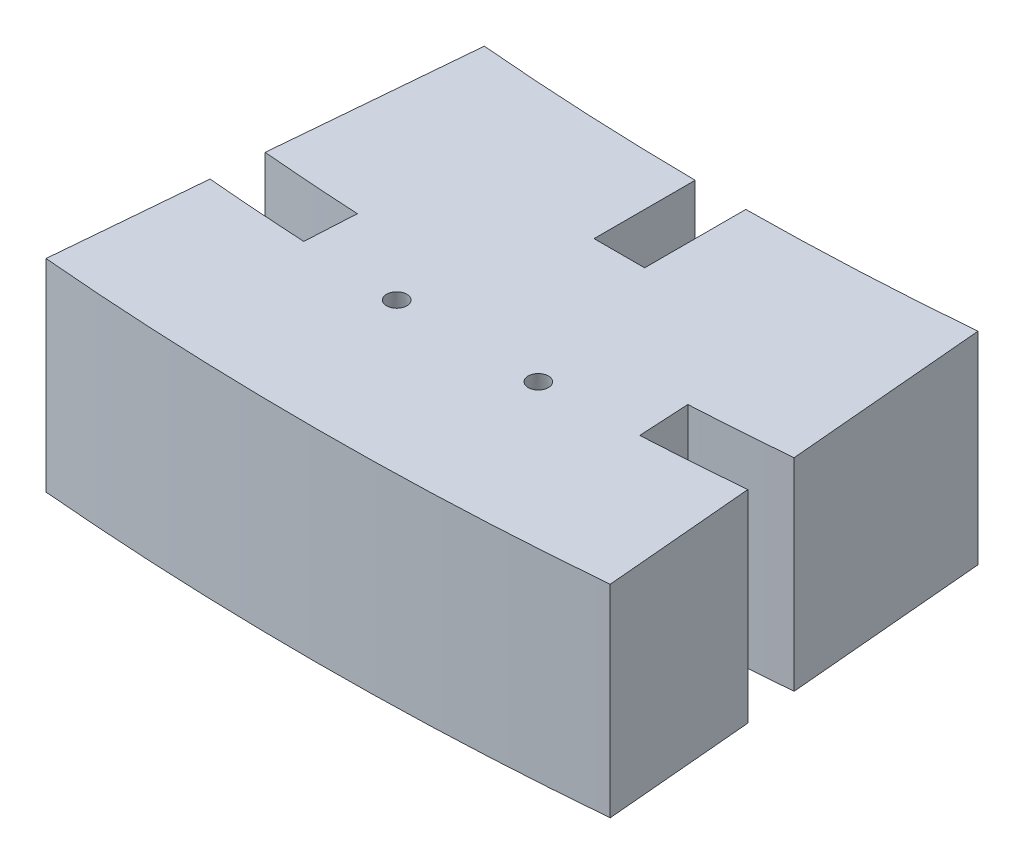
ISO-10303-21;
HEADER;
FILE_DESCRIPTION(('STEP AP214'),'2;1');
FILE_NAME('part.step','',(''),(''),'','','');
FILE_SCHEMA(('AUTOMOTIVE_DESIGN { 1 0 10303 214 1 1 1 1 }'));
ENDSEC;
DATA;
#1=APPLICATION_CONTEXT('core data for automotive mechanical design processes');
#2=APPLICATION_PROTOCOL_DEFINITION('international standard','automotive_design',2000,#1);
#3=PRODUCT_CONTEXT('',#1,'mechanical');
#4=PRODUCT('Part','Part','',(#3));
#5=PRODUCT_RELATED_PRODUCT_CATEGORY('part','',(#4));
#6=PRODUCT_DEFINITION_FORMATION('','',#4);
#7=PRODUCT_DEFINITION_CONTEXT('part definition',#1,'design');
#8=PRODUCT_DEFINITION('design','',#6,#7);
#9=PRODUCT_DEFINITION_SHAPE('','',#8);
#10=(LENGTH_UNIT() NAMED_UNIT(*) SI_UNIT(.MILLI.,.METRE.));
#11=(NAMED_UNIT(*) PLANE_ANGLE_UNIT() SI_UNIT($,.RADIAN.));
#12=(NAMED_UNIT(*) SI_UNIT($,.STERADIAN.) SOLID_ANGLE_UNIT());
#13=UNCERTAINTY_MEASURE_WITH_UNIT(LENGTH_MEASURE(1.E-05),#10,'distance_accuracy_value','');
#14=(GEOMETRIC_REPRESENTATION_CONTEXT(3) GLOBAL_UNCERTAINTY_ASSIGNED_CONTEXT((#13)) GLOBAL_UNIT_ASSIGNED_CONTEXT((#10,
#11,#12)) REPRESENTATION_CONTEXT('',''));
#15=CARTESIAN_POINT('',(0.,0.,0.));
#16=DIRECTION('',(0.,0.,1.));
#17=DIRECTION('',(1.,0.,0.));
#18=AXIS2_PLACEMENT_3D('',#15,#16,#17);
#19=CARTESIAN_POINT('',(-139.449188396242,100.,1593.91151694679));
#20=DIRECTION('',(0.996194698091746,0.,0.0871557427476512));
#21=DIRECTION('',(0.0871557427476512,0.,-0.996194698091746));
#22=AXIS2_PLACEMENT_3D('',#19,#20,#21);
#23=PLANE('',#22);
#24=DIRECTION('',(-0.0871557427476512,0.,0.996194698091746));
#25=VECTOR('',#24,1.);
#26=CARTESIAN_POINT('',(-139.449188396242,100.,1593.91151694679));
#27=LINE('',#26,#25);
#28=CARTESIAN_POINT('',(-132.92596998852,100.,1519.35078936419));
#29=VERTEX_POINT('',#28);
#30=CARTESIAN_POINT('',(-139.449188396242,100.,1593.91151694679));
#31=VERTEX_POINT('',#30);
#32=EDGE_CURVE('E257',#29,#31,#27,.T.);
#33=ORIENTED_EDGE('',*,*,#32,.F.);
#34=DIRECTION('',(0.,1.,0.));
#35=VECTOR('',#34,1.);
#36=CARTESIAN_POINT('',(-132.92596998852,0.,1519.35078936419));
#37=LINE('',#36,#35);
#38=CARTESIAN_POINT('',(-132.92596998852,0.,1519.35078936419));
#39=VERTEX_POINT('',#38);
#40=EDGE_CURVE('E178',#39,#29,#37,.T.);
#41=ORIENTED_EDGE('',*,*,#40,.F.);
#42=DIRECTION('',(-0.0871557427476512,0.,0.996194698091746));
#43=VECTOR('',#42,1.);
#44=CARTESIAN_POINT('',(-139.449188396242,0.,1593.91151694679));
#45=LINE('',#44,#43);
#46=CARTESIAN_POINT('',(-139.449188396242,0.,1593.91151694679));
#47=VERTEX_POINT('',#46);
#48=EDGE_CURVE('E272',#39,#47,#45,.T.);
#49=ORIENTED_EDGE('',*,*,#48,.T.);
#50=DIRECTION('',(0.,-1.,0.));
#51=VECTOR('',#50,1.);
#52=CARTESIAN_POINT('',(-139.449188396242,100.,1593.91151694679));
#53=LINE('',#52,#51);
#54=EDGE_CURVE('E44',#31,#47,#53,.T.);
#55=ORIENTED_EDGE('',*,*,#54,.F.);
#56=EDGE_LOOP('',(#33,#41,#49,#55));
#57=FACE_BOUND('',#56,.T.);
#58=ADVANCED_FACE('F36',(#57),#23,.F.);
#59=CARTESIAN_POINT('',(122.018039846722,100.,1394.67257732844));
#60=DIRECTION('',(-0.996194698091746,0.,0.0871557427476584));
#61=DIRECTION('',(0.0871557427476584,0.,0.996194698091746));
#62=AXIS2_PLACEMENT_3D('',#59,#60,#61);
#63=PLANE('',#62);
#64=DIRECTION('',(-0.0871557427476584,0.,-0.996194698091746));
#65=VECTOR('',#64,1.);
#66=CARTESIAN_POINT('',(122.018039846722,100.,1394.67257732844));
#67=LINE('',#66,#65);
#68=CARTESIAN_POINT('',(130.733614121487,100.,1494.29204713762));
#69=VERTEX_POINT('',#68);
#70=CARTESIAN_POINT('',(122.018039846722,100.,1394.67257732844));
#71=VERTEX_POINT('',#70);
#72=EDGE_CURVE('E264',#69,#71,#67,.T.);
#73=ORIENTED_EDGE('',*,*,#72,.F.);
#74=DIRECTION('',(0.,1.,0.));
#75=VECTOR('',#74,1.);
#76=CARTESIAN_POINT('',(130.733614121487,0.,1494.29204713762));
#77=LINE('',#76,#75);
#78=CARTESIAN_POINT('',(130.733614121487,0.,1494.29204713762));
#79=VERTEX_POINT('',#78);
#80=EDGE_CURVE('E180',#79,#69,#77,.T.);
#81=ORIENTED_EDGE('',*,*,#80,.F.);
#82=DIRECTION('',(-0.0871557427476584,0.,-0.996194698091746));
#83=VECTOR('',#82,1.);
#84=CARTESIAN_POINT('',(122.018039846722,0.,1394.67257732844));
#85=LINE('',#84,#83);
#86=CARTESIAN_POINT('',(122.018039846722,0.,1394.67257732844));
#87=VERTEX_POINT('',#86);
#88=EDGE_CURVE('E170',#79,#87,#85,.T.);
#89=ORIENTED_EDGE('',*,*,#88,.T.);
#90=DIRECTION('',(0.,-1.,0.));
#91=VECTOR('',#90,1.);
#92=CARTESIAN_POINT('',(122.018039846722,100.,1394.67257732844));
#93=LINE('',#92,#91);
#94=EDGE_CURVE('E268',#71,#87,#93,.T.);
#95=ORIENTED_EDGE('',*,*,#94,.F.);
#96=EDGE_LOOP('',(#73,#81,#89,#95));
#97=FACE_BOUND('',#96,.T.);
#98=ADVANCED_FACE('F339',(#97),#63,.F.);
#99=CARTESIAN_POINT('',(0.,100.,0.));
#100=DIRECTION('',(0.,-1.,0.));
#101=DIRECTION('',(0.,0.,-1.));
#102=AXIS2_PLACEMENT_3D('',#99,#100,#101);
#103=CYLINDRICAL_SURFACE('',#102,1400.);
#104=CARTESIAN_POINT('',(0.,100.,0.));
#105=DIRECTION('',(0.,-1.,0.));
#106=DIRECTION('',(0.,0.,1.));
#107=AXIS2_PLACEMENT_3D('',#104,#105,#106);
#108=CIRCLE('',#107,1400.);
#109=CARTESIAN_POINT('',(-12.4999999999998,100.,1399.94419531637));
#110=VERTEX_POINT('',#109);
#111=CARTESIAN_POINT('',(-122.018039846712,100.,1394.67257732844));
#112=VERTEX_POINT('',#111);
#113=EDGE_CURVE('E258',#110,#112,#108,.T.);
#114=ORIENTED_EDGE('',*,*,#113,.F.);
#115=DIRECTION('',(0.,1.,0.));
#116=VECTOR('',#115,1.);
#117=CARTESIAN_POINT('',(-12.4999999999998,0.,1399.94419531637));
#118=LINE('',#117,#116);
#119=CARTESIAN_POINT('',(-12.4999999999998,0.,1399.94419531637));
#120=VERTEX_POINT('',#119);
#121=EDGE_CURVE('E248',#120,#110,#118,.T.);
#122=ORIENTED_EDGE('',*,*,#121,.F.);
#123=CARTESIAN_POINT('',(0.,0.,0.));
#124=DIRECTION('',(0.,-1.,0.));
#125=DIRECTION('',(0.,0.,1.));
#126=AXIS2_PLACEMENT_3D('',#123,#124,#125);
#127=CIRCLE('',#126,1400.);
#128=CARTESIAN_POINT('',(-122.018039846712,0.,1394.67257732844));
#129=VERTEX_POINT('',#128);
#130=EDGE_CURVE('E247',#120,#129,#127,.T.);
#131=ORIENTED_EDGE('',*,*,#130,.T.);
#132=DIRECTION('',(0.,-1.,0.));
#133=VECTOR('',#132,1.);
#134=CARTESIAN_POINT('',(-122.018039846712,100.,1394.67257732844));
#135=LINE('',#134,#133);
#136=EDGE_CURVE('E11',#112,#129,#135,.T.);
#137=ORIENTED_EDGE('',*,*,#136,.F.);
#138=EDGE_LOOP('',(#114,#122,#131,#137));
#139=FACE_BOUND('',#138,.T.);
#140=ADVANCED_FACE('F323',(#139),#103,.F.);
#141=CARTESIAN_POINT('',(12.5000000000002,0.,1399.94419531637));
#142=VERTEX_POINT('',#141);
#143=EDGE_CURVE('E269',#87,#142,#127,.T.);
#144=ORIENTED_EDGE('',*,*,#143,.T.);
#145=DIRECTION('',(0.,1.,0.));
#146=VECTOR('',#145,1.);
#147=CARTESIAN_POINT('',(12.5000000000002,0.,1399.94419531637));
#148=LINE('',#147,#146);
#149=CARTESIAN_POINT('',(12.5000000000002,100.,1399.94419531637));
#150=VERTEX_POINT('',#149);
#151=EDGE_CURVE('E250',#142,#150,#148,.T.);
#152=ORIENTED_EDGE('',*,*,#151,.T.);
#153=EDGE_CURVE('E254',#71,#150,#108,.T.);
#154=ORIENTED_EDGE('',*,*,#153,.F.);
#155=ORIENTED_EDGE('',*,*,#94,.T.);
#156=EDGE_LOOP('',(#144,#152,#154,#155));
#157=FACE_BOUND('',#156,.T.);
#158=ADVANCED_FACE('F38',(#157),#103,.F.);
#159=CARTESIAN_POINT('',(-130.733614121477,0.,1494.29204713762));
#160=VERTEX_POINT('',#159);
#161=EDGE_CURVE('E273',#129,#160,#45,.T.);
#162=ORIENTED_EDGE('',*,*,#161,.T.);
#163=DIRECTION('',(0.,1.,0.));
#164=VECTOR('',#163,1.);
#165=CARTESIAN_POINT('',(-130.733614121477,0.,1494.29204713762));
#166=LINE('',#165,#164);
#167=CARTESIAN_POINT('',(-130.733614121477,100.,1494.29204713762));
#168=VERTEX_POINT('',#167);
#169=EDGE_CURVE('E204',#160,#168,#166,.T.);
#170=ORIENTED_EDGE('',*,*,#169,.T.);
#171=EDGE_CURVE('E259',#112,#168,#27,.T.);
#172=ORIENTED_EDGE('',*,*,#171,.F.);
#173=ORIENTED_EDGE('',*,*,#136,.T.);
#174=EDGE_LOOP('',(#162,#170,#172,#173));
#175=FACE_BOUND('',#174,.T.);
#176=ADVANCED_FACE('F316',(#175),#23,.F.);
#177=CARTESIAN_POINT('',(0.,100.,0.));
#178=DIRECTION('',(0.,-1.,0.));
#179=DIRECTION('',(0.,0.,-1.));
#180=AXIS2_PLACEMENT_3D('',#177,#178,#179);
#181=CYLINDRICAL_SURFACE('',#180,1600.);
#182=CARTESIAN_POINT('',(0.,0.,0.));
#183=DIRECTION('',(0.,1.,0.));
#184=DIRECTION('',(0.,0.,1.));
#185=AXIS2_PLACEMENT_3D('',#182,#183,#184);
#186=CIRCLE('',#185,1600.);
#187=CARTESIAN_POINT('',(139.449188396253,0.,1593.91151694679));
#188=VERTEX_POINT('',#187);
#189=EDGE_CURVE('E276',#47,#188,#186,.T.);
#190=ORIENTED_EDGE('',*,*,#189,.T.);
#191=DIRECTION('',(0.,-1.,0.));
#192=VECTOR('',#191,1.);
#193=CARTESIAN_POINT('',(139.449188396253,100.,1593.91151694679));
#194=LINE('',#193,#192);
#195=CARTESIAN_POINT('',(139.449188396253,100.,1593.91151694679));
#196=VERTEX_POINT('',#195);
#197=EDGE_CURVE('E283',#196,#188,#194,.T.);
#198=ORIENTED_EDGE('',*,*,#197,.F.);
#199=CARTESIAN_POINT('',(0.,100.,0.));
#200=DIRECTION('',(0.,1.,0.));
#201=DIRECTION('',(0.,0.,1.));
#202=AXIS2_PLACEMENT_3D('',#199,#200,#201);
#203=CIRCLE('',#202,1600.);
#204=EDGE_CURVE('E262',#31,#196,#203,.T.);
#205=ORIENTED_EDGE('',*,*,#204,.F.);
#206=ORIENTED_EDGE('',*,*,#54,.T.);
#207=EDGE_LOOP('',(#190,#198,#205,#206));
#208=FACE_BOUND('',#207,.T.);
#209=ADVANCED_FACE('F290',(#208),#181,.T.);
#210=CARTESIAN_POINT('',(132.925969988531,0.,1519.35078936419));
#211=VERTEX_POINT('',#210);
#212=EDGE_CURVE('E278',#188,#211,#85,.T.);
#213=ORIENTED_EDGE('',*,*,#212,.T.);
#214=DIRECTION('',(0.,1.,0.));
#215=VECTOR('',#214,1.);
#216=CARTESIAN_POINT('',(132.925969988531,0.,1519.35078936419));
#217=LINE('',#216,#215);
#218=CARTESIAN_POINT('',(132.925969988531,100.,1519.35078936419));
#219=VERTEX_POINT('',#218);
#220=EDGE_CURVE('E183',#211,#219,#217,.T.);
#221=ORIENTED_EDGE('',*,*,#220,.T.);
#222=EDGE_CURVE('E265',#196,#219,#67,.T.);
#223=ORIENTED_EDGE('',*,*,#222,.F.);
#224=ORIENTED_EDGE('',*,*,#197,.T.);
#225=EDGE_LOOP('',(#213,#221,#223,#224));
#226=FACE_BOUND('',#225,.T.);
#227=ADVANCED_FACE('F297',(#226),#63,.F.);
#228=CARTESIAN_POINT('',(0.,100.,0.));
#229=DIRECTION('',(0.,1.,0.));
#230=DIRECTION('',(0.,0.,1.));
#231=AXIS2_PLACEMENT_3D('',#228,#229,#230);
#232=PLANE('',#231);
#233=CARTESIAN_POINT('',(0.,100.,0.));
#234=DIRECTION('',(0.,-1.,0.));
#235=DIRECTION('',(0.,0.,1.));
#236=AXIS2_PLACEMENT_3D('',#233,#234,#235);
#237=CIRCLE('',#236,1500.);
#238=CARTESIAN_POINT('',(81.6751214595346,100.,1497.77474091886));
#239=VERTEX_POINT('',#238);
#240=EDGE_CURVE('E155',#69,#239,#237,.T.);
#241=ORIENTED_EDGE('',*,*,#240,.F.);
#242=ORIENTED_EDGE('',*,*,#72,.T.);
#243=ORIENTED_EDGE('',*,*,#153,.T.);
#244=DIRECTION('',(0.,0.,-1.));
#245=VECTOR('',#244,1.);
#246=CARTESIAN_POINT('',(12.5000000000002,100.,1449.94419531637));
#247=LINE('',#246,#245);
#248=CARTESIAN_POINT('',(12.5000000000002,100.,1449.94419531637));
#249=VERTEX_POINT('',#248);
#250=EDGE_CURVE('E241',#249,#150,#247,.T.);
#251=ORIENTED_EDGE('',*,*,#250,.F.);
#252=DIRECTION('',(1.,0.,0.));
#253=VECTOR('',#252,1.);
#254=CARTESIAN_POINT('',(1.78676518025611E-13,100.,1449.94419531637));
#255=LINE('',#254,#253);
#256=CARTESIAN_POINT('',(-12.4999999999998,100.,1449.94419531637));
#257=VERTEX_POINT('',#256);
#258=EDGE_CURVE('E227',#257,#249,#255,.T.);
#259=ORIENTED_EDGE('',*,*,#258,.F.);
#260=DIRECTION('',(0.,0.,1.));
#261=VECTOR('',#260,1.);
#262=CARTESIAN_POINT('',(-12.4999999999998,100.,1449.94419531637));
#263=LINE('',#262,#261);
#264=EDGE_CURVE('E232',#110,#257,#263,.T.);
#265=ORIENTED_EDGE('',*,*,#264,.F.);
#266=ORIENTED_EDGE('',*,*,#113,.T.);
#267=ORIENTED_EDGE('',*,*,#171,.T.);
#268=CARTESIAN_POINT('',(0.,100.,0.));
#269=DIRECTION('',(0.,-1.,0.));
#270=DIRECTION('',(0.,0.,1.));
#271=AXIS2_PLACEMENT_3D('',#268,#269,#270);
#272=CIRCLE('',#271,1500.);
#273=CARTESIAN_POINT('',(-81.6751214595243,100.,1497.77474091886));
#274=VERTEX_POINT('',#273);
#275=EDGE_CURVE('E191',#274,#168,#272,.T.);
#276=ORIENTED_EDGE('',*,*,#275,.F.);
#277=DIRECTION('',(0.054450080973017,0.,-0.99851649394591));
#278=VECTOR('',#277,1.);
#279=CARTESIAN_POINT('',(-83.0447839822546,100.,1522.8918866723));
#280=LINE('',#279,#278);
#281=CARTESIAN_POINT('',(-83.0447839822546,100.,1522.8918866723));
#282=VERTEX_POINT('',#281);
#283=EDGE_CURVE('E199',#282,#274,#280,.T.);
#284=ORIENTED_EDGE('',*,*,#283,.F.);
#285=CARTESIAN_POINT('',(0.,100.,0.));
#286=DIRECTION('',(0.,1.,0.));
#287=DIRECTION('',(0.,0.,1.));
#288=AXIS2_PLACEMENT_3D('',#285,#286,#287);
#289=CIRCLE('',#288,1525.15446255092);
#290=EDGE_CURVE('E196',#29,#282,#289,.T.);
#291=ORIENTED_EDGE('',*,*,#290,.F.);
#292=ORIENTED_EDGE('',*,*,#32,.T.);
#293=ORIENTED_EDGE('',*,*,#204,.T.);
#294=ORIENTED_EDGE('',*,*,#222,.T.);
#295=CARTESIAN_POINT('',(0.,100.,0.));
#296=DIRECTION('',(0.,1.,0.));
#297=DIRECTION('',(0.,0.,1.));
#298=AXIS2_PLACEMENT_3D('',#295,#296,#297);
#299=CIRCLE('',#298,1525.15446255092);
#300=CARTESIAN_POINT('',(83.0447839822651,100.,1522.8918866723));
#301=VERTEX_POINT('',#300);
#302=EDGE_CURVE('E171',#301,#219,#299,.T.);
#303=ORIENTED_EDGE('',*,*,#302,.F.);
#304=DIRECTION('',(0.0544500809730236,0.,0.998516493945909));
#305=VECTOR('',#304,1.);
#306=CARTESIAN_POINT('',(81.6751214595346,100.,1497.77474091886));
#307=LINE('',#306,#305);
#308=EDGE_CURVE('E173',#239,#301,#307,.T.);
#309=ORIENTED_EDGE('',*,*,#308,.F.);
#310=EDGE_LOOP('',(#241,#242,#243,#251,#259,#265,#266,#267,#276,#284,#291,#292,#293,#294,#303,#309));
#311=FACE_BOUND('',#310,.T.);
#312=CARTESIAN_POINT('',(35.0000000000003,100.,1525.));
#313=DIRECTION('',(0.,1.,0.));
#314=DIRECTION('',(0.,0.,-1.));
#315=AXIS2_PLACEMENT_3D('',#312,#313,#314);
#316=CIRCLE('',#315,4.99999999999989);
#317=CARTESIAN_POINT('',(35.0000000000003,100.,1520.));
#318=VERTEX_POINT('',#317);
#319=EDGE_CURVE('E215',#318,#318,#316,.T.);
#320=ORIENTED_EDGE('',*,*,#319,.F.);
#321=EDGE_LOOP('',(#320));
#322=FACE_BOUND('',#321,.T.);
#323=CARTESIAN_POINT('',(-35.0000000000006,100.,1525.));
#324=DIRECTION('',(0.,-1.,0.));
#325=DIRECTION('',(0.,0.,-1.));
#326=AXIS2_PLACEMENT_3D('',#323,#324,#325);
#327=CIRCLE('',#326,4.99999999999989);
#328=CARTESIAN_POINT('',(-35.0000000000006,100.,1520.));
#329=VERTEX_POINT('',#328);
#330=EDGE_CURVE('E224',#329,#329,#327,.T.);
#331=ORIENTED_EDGE('',*,*,#330,.T.);
#332=EDGE_LOOP('',(#331));
#333=FACE_BOUND('',#332,.T.);
#334=ADVANCED_FACE('F301',(#311,#322,#333),#232,.T.);
#335=CARTESIAN_POINT('',(0.,0.,0.));
#336=DIRECTION('',(0.,1.,0.));
#337=DIRECTION('',(0.,0.,1.));
#338=AXIS2_PLACEMENT_3D('',#335,#336,#337);
#339=PLANE('',#338);
#340=ORIENTED_EDGE('',*,*,#88,.F.);
#341=CARTESIAN_POINT('',(0.,0.,0.));
#342=DIRECTION('',(0.,-1.,0.));
#343=DIRECTION('',(0.,0.,1.));
#344=AXIS2_PLACEMENT_3D('',#341,#342,#343);
#345=CIRCLE('',#344,1500.);
#346=CARTESIAN_POINT('',(81.6751214595346,0.,1497.77474091886));
#347=VERTEX_POINT('',#346);
#348=EDGE_CURVE('E152',#79,#347,#345,.T.);
#349=ORIENTED_EDGE('',*,*,#348,.T.);
#350=DIRECTION('',(0.0544500809730236,0.,0.998516493945909));
#351=VECTOR('',#350,1.);
#352=CARTESIAN_POINT('',(81.6751214595346,0.,1497.77474091886));
#353=LINE('',#352,#351);
#354=CARTESIAN_POINT('',(83.0447839822659,0.,1522.8918866723));
#355=VERTEX_POINT('',#354);
#356=EDGE_CURVE('E162',#347,#355,#353,.T.);
#357=ORIENTED_EDGE('',*,*,#356,.T.);
#358=CARTESIAN_POINT('',(0.,0.,0.));
#359=DIRECTION('',(0.,1.,0.));
#360=DIRECTION('',(0.,0.,1.));
#361=AXIS2_PLACEMENT_3D('',#358,#359,#360);
#362=CIRCLE('',#361,1525.15446255092);
#363=EDGE_CURVE('E51',#355,#211,#362,.T.);
#364=ORIENTED_EDGE('',*,*,#363,.T.);
#365=ORIENTED_EDGE('',*,*,#212,.F.);
#366=ORIENTED_EDGE('',*,*,#189,.F.);
#367=ORIENTED_EDGE('',*,*,#48,.F.);
#368=CARTESIAN_POINT('',(0.,0.,0.));
#369=DIRECTION('',(0.,1.,0.));
#370=DIRECTION('',(0.,0.,1.));
#371=AXIS2_PLACEMENT_3D('',#368,#369,#370);
#372=CIRCLE('',#371,1525.15446255092);
#373=CARTESIAN_POINT('',(-83.0447839822546,0.,1522.8918866723));
#374=VERTEX_POINT('',#373);
#375=EDGE_CURVE('E187',#39,#374,#372,.T.);
#376=ORIENTED_EDGE('',*,*,#375,.T.);
#377=DIRECTION('',(0.054450080973017,0.,-0.99851649394591));
#378=VECTOR('',#377,1.);
#379=CARTESIAN_POINT('',(-83.0447839822546,0.,1522.8918866723));
#380=LINE('',#379,#378);
#381=CARTESIAN_POINT('',(-81.6751214595255,0.,1497.77474091886));
#382=VERTEX_POINT('',#381);
#383=EDGE_CURVE('E190',#374,#382,#380,.T.);
#384=ORIENTED_EDGE('',*,*,#383,.T.);
#385=CARTESIAN_POINT('',(0.,0.,0.));
#386=DIRECTION('',(0.,-1.,0.));
#387=DIRECTION('',(0.,0.,1.));
#388=AXIS2_PLACEMENT_3D('',#385,#386,#387);
#389=CIRCLE('',#388,1500.);
#390=EDGE_CURVE('E59',#382,#160,#389,.T.);
#391=ORIENTED_EDGE('',*,*,#390,.T.);
#392=ORIENTED_EDGE('',*,*,#161,.F.);
#393=ORIENTED_EDGE('',*,*,#130,.F.);
#394=DIRECTION('',(0.,0.,1.));
#395=VECTOR('',#394,1.);
#396=CARTESIAN_POINT('',(-12.4999999999998,0.,1449.94419531637));
#397=LINE('',#396,#395);
#398=CARTESIAN_POINT('',(-12.4999999999998,0.,1449.94419531637));
#399=VERTEX_POINT('',#398);
#400=EDGE_CURVE('E235',#120,#399,#397,.T.);
#401=ORIENTED_EDGE('',*,*,#400,.T.);
#402=DIRECTION('',(1.,0.,0.));
#403=VECTOR('',#402,1.);
#404=CARTESIAN_POINT('',(1.78676518025611E-13,0.,1449.94419531637));
#405=LINE('',#404,#403);
#406=CARTESIAN_POINT('',(12.5000000000002,0.,1449.94419531637));
#407=VERTEX_POINT('',#406);
#408=EDGE_CURVE('E228',#399,#407,#405,.T.);
#409=ORIENTED_EDGE('',*,*,#408,.T.);
#410=DIRECTION('',(0.,0.,-1.));
#411=VECTOR('',#410,1.);
#412=CARTESIAN_POINT('',(12.5000000000002,0.,1449.94419531637));
#413=LINE('',#412,#411);
#414=EDGE_CURVE('E231',#407,#142,#413,.T.);
#415=ORIENTED_EDGE('',*,*,#414,.T.);
#416=ORIENTED_EDGE('',*,*,#143,.F.);
#417=EDGE_LOOP('',(#340,#349,#357,#364,#365,#366,#367,#376,#384,#391,#392,#393,#401,#409,#415,#416));
#418=FACE_BOUND('',#417,.T.);
#419=CARTESIAN_POINT('',(35.0000000000003,0.,1525.));
#420=DIRECTION('',(0.,1.,0.));
#421=DIRECTION('',(0.,0.,-1.));
#422=AXIS2_PLACEMENT_3D('',#419,#420,#421);
#423=CIRCLE('',#422,13.6824088833463);
#424=CARTESIAN_POINT('',(35.0000000000003,0.,1511.31759111665));
#425=VERTEX_POINT('',#424);
#426=EDGE_CURVE('E182',#425,#425,#423,.T.);
#427=ORIENTED_EDGE('',*,*,#426,.T.);
#428=EDGE_LOOP('',(#427));
#429=FACE_BOUND('',#428,.T.);
#430=CARTESIAN_POINT('',(-35.0000000000006,0.,1525.));
#431=DIRECTION('',(0.,-1.,0.));
#432=DIRECTION('',(0.,0.,-1.));
#433=AXIS2_PLACEMENT_3D('',#430,#431,#432);
#434=CIRCLE('',#433,13.6824088833463);
#435=CARTESIAN_POINT('',(-35.0000000000006,0.,1511.31759111665));
#436=VERTEX_POINT('',#435);
#437=EDGE_CURVE('E218',#436,#436,#434,.T.);
#438=ORIENTED_EDGE('',*,*,#437,.F.);
#439=EDGE_LOOP('',(#438));
#440=FACE_BOUND('',#439,.T.);
#441=ADVANCED_FACE('F167',(#418,#429,#440),#339,.F.);
#442=CARTESIAN_POINT('',(-12.4999999999998,0.,1449.94419531637));
#443=DIRECTION('',(-1.,0.,0.));
#444=DIRECTION('',(0.,0.,1.));
#445=AXIS2_PLACEMENT_3D('',#442,#443,#444);
#446=PLANE('',#445);
#447=ORIENTED_EDGE('',*,*,#264,.T.);
#448=DIRECTION('',(0.,1.,0.));
#449=VECTOR('',#448,1.);
#450=CARTESIAN_POINT('',(-12.4999999999998,0.,1449.94419531637));
#451=LINE('',#450,#449);
#452=EDGE_CURVE('E245',#399,#257,#451,.T.);
#453=ORIENTED_EDGE('',*,*,#452,.F.);
#454=ORIENTED_EDGE('',*,*,#400,.F.);
#455=ORIENTED_EDGE('',*,*,#121,.T.);
#456=EDGE_LOOP('',(#447,#453,#454,#455));
#457=FACE_BOUND('',#456,.T.);
#458=ADVANCED_FACE('F327',(#457),#446,.F.);
#459=CARTESIAN_POINT('',(12.5000000000002,0.,1449.94419531637));
#460=DIRECTION('',(1.,0.,0.));
#461=DIRECTION('',(0.,0.,-1.));
#462=AXIS2_PLACEMENT_3D('',#459,#460,#461);
#463=PLANE('',#462);
#464=ORIENTED_EDGE('',*,*,#250,.T.);
#465=ORIENTED_EDGE('',*,*,#151,.F.);
#466=ORIENTED_EDGE('',*,*,#414,.F.);
#467=DIRECTION('',(0.,1.,0.));
#468=VECTOR('',#467,1.);
#469=CARTESIAN_POINT('',(12.5000000000002,0.,1449.94419531637));
#470=LINE('',#469,#468);
#471=EDGE_CURVE('E238',#407,#249,#470,.T.);
#472=ORIENTED_EDGE('',*,*,#471,.T.);
#473=EDGE_LOOP('',(#464,#465,#466,#472));
#474=FACE_BOUND('',#473,.T.);
#475=ADVANCED_FACE('F333',(#474),#463,.F.);
#476=CARTESIAN_POINT('',(1.78676518025611E-13,0.,1449.94419531637));
#477=DIRECTION('',(0.,0.,1.));
#478=DIRECTION('',(1.,0.,0.));
#479=AXIS2_PLACEMENT_3D('',#476,#477,#478);
#480=PLANE('',#479);
#481=ORIENTED_EDGE('',*,*,#258,.T.);
#482=ORIENTED_EDGE('',*,*,#471,.F.);
#483=ORIENTED_EDGE('',*,*,#408,.F.);
#484=ORIENTED_EDGE('',*,*,#452,.T.);
#485=EDGE_LOOP('',(#481,#482,#483,#484));
#486=FACE_BOUND('',#485,.T.);
#487=ADVANCED_FACE('F330',(#486),#480,.F.);
#488=CARTESIAN_POINT('',(-35.0000000000006,100.,1525.));
#489=DIRECTION('',(0.,-1.,0.));
#490=DIRECTION('',(0.,0.,-1.));
#491=AXIS2_PLACEMENT_3D('',#488,#489,#490);
#492=CONICAL_SURFACE('',#491,4.99999999999989,0.17453292519943);
#493=CARTESIAN_POINT('',(-35.0000000000006,50.7596123493896,1525.));
#494=DIRECTION('',(0.,-1.,0.));
#495=DIRECTION('',(0.,0.,-1.));
#496=AXIS2_PLACEMENT_3D('',#493,#494,#495);
#497=CIRCLE('',#496,13.6824088833463);
#498=CARTESIAN_POINT('',(-35.0000000000006,50.7596123493896,1511.31759111665));
#499=VERTEX_POINT('',#498);
#500=EDGE_CURVE('E221',#499,#499,#497,.T.);
#501=ORIENTED_EDGE('',*,*,#500,.T.);
#502=EDGE_LOOP('',(#501));
#503=FACE_BOUND('',#502,.T.);
#504=ORIENTED_EDGE('',*,*,#330,.F.);
#505=EDGE_LOOP('',(#504));
#506=FACE_BOUND('',#505,.T.);
#507=ADVANCED_FACE('F458',(#503,#506),#492,.F.);
#508=CARTESIAN_POINT('',(-35.0000000000006,0.,1525.));
#509=DIRECTION('',(0.,-1.,0.));
#510=DIRECTION('',(0.,0.,-1.));
#511=AXIS2_PLACEMENT_3D('',#508,#509,#510);
#512=CYLINDRICAL_SURFACE('',#511,13.6824088833463);
#513=ORIENTED_EDGE('',*,*,#437,.T.);
#514=EDGE_LOOP('',(#513));
#515=FACE_BOUND('',#514,.T.);
#516=ORIENTED_EDGE('',*,*,#500,.F.);
#517=EDGE_LOOP('',(#516));
#518=FACE_BOUND('',#517,.T.);
#519=ADVANCED_FACE('F454',(#515,#518),#512,.F.);
#520=CARTESIAN_POINT('',(35.0000000000003,100.,1525.));
#521=DIRECTION('',(0.,-1.,0.));
#522=DIRECTION('',(0.,0.,-1.));
#523=AXIS2_PLACEMENT_3D('',#520,#521,#522);
#524=CONICAL_SURFACE('',#523,4.99999999999989,0.17453292519943);
#525=CARTESIAN_POINT('',(35.0000000000003,50.7596123493896,1525.));
#526=DIRECTION('',(0.,1.,0.));
#527=DIRECTION('',(0.,0.,-1.));
#528=AXIS2_PLACEMENT_3D('',#525,#526,#527);
#529=CIRCLE('',#528,13.6824088833463);
#530=CARTESIAN_POINT('',(35.0000000000003,50.7596123493896,1511.31759111665));
#531=VERTEX_POINT('',#530);
#532=EDGE_CURVE('E212',#531,#531,#529,.T.);
#533=ORIENTED_EDGE('',*,*,#532,.F.);
#534=EDGE_LOOP('',(#533));
#535=FACE_BOUND('',#534,.T.);
#536=ORIENTED_EDGE('',*,*,#319,.T.);
#537=EDGE_LOOP('',(#536));
#538=FACE_BOUND('',#537,.T.);
#539=ADVANCED_FACE('F450',(#535,#538),#524,.F.);
#540=CARTESIAN_POINT('',(35.0000000000003,0.,1525.));
#541=DIRECTION('',(0.,-1.,0.));
#542=DIRECTION('',(0.,0.,-1.));
#543=AXIS2_PLACEMENT_3D('',#540,#541,#542);
#544=CYLINDRICAL_SURFACE('',#543,13.6824088833463);
#545=ORIENTED_EDGE('',*,*,#426,.F.);
#546=EDGE_LOOP('',(#545));
#547=FACE_BOUND('',#546,.T.);
#548=ORIENTED_EDGE('',*,*,#532,.T.);
#549=EDGE_LOOP('',(#548));
#550=FACE_BOUND('',#549,.T.);
#551=ADVANCED_FACE('F401',(#547,#550),#544,.F.);
#552=CARTESIAN_POINT('',(0.,0.,0.));
#553=DIRECTION('',(0.,1.,0.));
#554=DIRECTION('',(0.,0.,1.));
#555=AXIS2_PLACEMENT_3D('',#552,#553,#554);
#556=CYLINDRICAL_SURFACE('',#555,1525.15446255092);
#557=ORIENTED_EDGE('',*,*,#290,.T.);
#558=DIRECTION('',(0.,1.,0.));
#559=VECTOR('',#558,1.);
#560=CARTESIAN_POINT('',(-83.0447839822546,0.,1522.8918866723));
#561=LINE('',#560,#559);
#562=EDGE_CURVE('E195',#374,#282,#561,.T.);
#563=ORIENTED_EDGE('',*,*,#562,.F.);
#564=ORIENTED_EDGE('',*,*,#375,.F.);
#565=ORIENTED_EDGE('',*,*,#40,.T.);
#566=EDGE_LOOP('',(#557,#563,#564,#565));
#567=FACE_BOUND('',#566,.T.);
#568=ADVANCED_FACE('F307',(#567),#556,.F.);
#569=CARTESIAN_POINT('',(0.,0.,0.));
#570=DIRECTION('',(0.,1.,0.));
#571=DIRECTION('',(0.,0.,1.));
#572=AXIS2_PLACEMENT_3D('',#569,#570,#571);
#573=CYLINDRICAL_SURFACE('',#572,1500.);
#574=ORIENTED_EDGE('',*,*,#275,.T.);
#575=ORIENTED_EDGE('',*,*,#169,.F.);
#576=ORIENTED_EDGE('',*,*,#390,.F.);
#577=DIRECTION('',(0.,1.,0.));
#578=VECTOR('',#577,1.);
#579=CARTESIAN_POINT('',(-81.6751214595243,0.,1497.77474091886));
#580=LINE('',#579,#578);
#581=EDGE_CURVE('E207',#382,#274,#580,.T.);
#582=ORIENTED_EDGE('',*,*,#581,.T.);
#583=EDGE_LOOP('',(#574,#575,#576,#582));
#584=FACE_BOUND('',#583,.T.);
#585=ADVANCED_FACE('F313',(#584),#573,.T.);
#586=CARTESIAN_POINT('',(-83.0447839822546,0.,1522.8918866723));
#587=DIRECTION('',(0.99851649394591,0.,0.054450080973017));
#588=DIRECTION('',(0.054450080973017,0.,-0.99851649394591));
#589=AXIS2_PLACEMENT_3D('',#586,#587,#588);
#590=PLANE('',#589);
#591=ORIENTED_EDGE('',*,*,#283,.T.);
#592=ORIENTED_EDGE('',*,*,#581,.F.);
#593=ORIENTED_EDGE('',*,*,#383,.F.);
#594=ORIENTED_EDGE('',*,*,#562,.T.);
#595=EDGE_LOOP('',(#591,#592,#593,#594));
#596=FACE_BOUND('',#595,.T.);
#597=ADVANCED_FACE('F311',(#596),#590,.F.);
#598=CARTESIAN_POINT('',(0.,0.,0.));
#599=DIRECTION('',(0.,1.,0.));
#600=DIRECTION('',(0.,0.,1.));
#601=AXIS2_PLACEMENT_3D('',#598,#599,#600);
#602=CYLINDRICAL_SURFACE('',#601,1500.);
#603=ORIENTED_EDGE('',*,*,#240,.T.);
#604=DIRECTION('',(0.,1.,0.));
#605=VECTOR('',#604,1.);
#606=CARTESIAN_POINT('',(81.6751214595346,0.,1497.77474091886));
#607=LINE('',#606,#605);
#608=EDGE_CURVE('E148',#347,#239,#607,.T.);
#609=ORIENTED_EDGE('',*,*,#608,.F.);
#610=ORIENTED_EDGE('',*,*,#348,.F.);
#611=ORIENTED_EDGE('',*,*,#80,.T.);
#612=EDGE_LOOP('',(#603,#609,#610,#611));
#613=FACE_BOUND('',#612,.T.);
#614=ADVANCED_FACE('F150',(#613),#602,.T.);
#615=CARTESIAN_POINT('',(0.,0.,0.));
#616=DIRECTION('',(0.,1.,0.));
#617=DIRECTION('',(0.,0.,1.));
#618=AXIS2_PLACEMENT_3D('',#615,#616,#617);
#619=CYLINDRICAL_SURFACE('',#618,1525.15446255092);
#620=ORIENTED_EDGE('',*,*,#302,.T.);
#621=ORIENTED_EDGE('',*,*,#220,.F.);
#622=ORIENTED_EDGE('',*,*,#363,.F.);
#623=DIRECTION('',(0.,1.,0.));
#624=VECTOR('',#623,1.);
#625=CARTESIAN_POINT('',(83.0447839822651,0.,1522.8918866723));
#626=LINE('',#625,#624);
#627=EDGE_CURVE('E159',#355,#301,#626,.T.);
#628=ORIENTED_EDGE('',*,*,#627,.T.);
#629=EDGE_LOOP('',(#620,#621,#622,#628));
#630=FACE_BOUND('',#629,.T.);
#631=ADVANCED_FACE('F428',(#630),#619,.F.);
#632=CARTESIAN_POINT('',(81.6751214595346,0.,1497.77474091886));
#633=DIRECTION('',(-0.998516493945909,0.,0.0544500809730236));
#634=DIRECTION('',(0.0544500809730236,0.,0.998516493945909));
#635=AXIS2_PLACEMENT_3D('',#632,#633,#634);
#636=PLANE('',#635);
#637=ORIENTED_EDGE('',*,*,#308,.T.);
#638=ORIENTED_EDGE('',*,*,#627,.F.);
#639=ORIENTED_EDGE('',*,*,#356,.F.);
#640=ORIENTED_EDGE('',*,*,#608,.T.);
#641=EDGE_LOOP('',(#637,#638,#639,#640));
#642=FACE_BOUND('',#641,.T.);
#643=ADVANCED_FACE('F163',(#642),#636,.F.);
#644=CLOSED_SHELL('',(#58,#98,#140,#158,#176,#209,#227,#334,#441,#458,#475,#487,#507,#519,#539,
#551,#568,#585,#597,#614,#631,#643));
#645=MANIFOLD_SOLID_BREP('B2',#644);
#646=ADVANCED_BREP_SHAPE_REPRESENTATION('',(#18,#645),#14);
#647=SHAPE_DEFINITION_REPRESENTATION(#9,#646);
ENDSEC;
END-ISO-10303-21;
